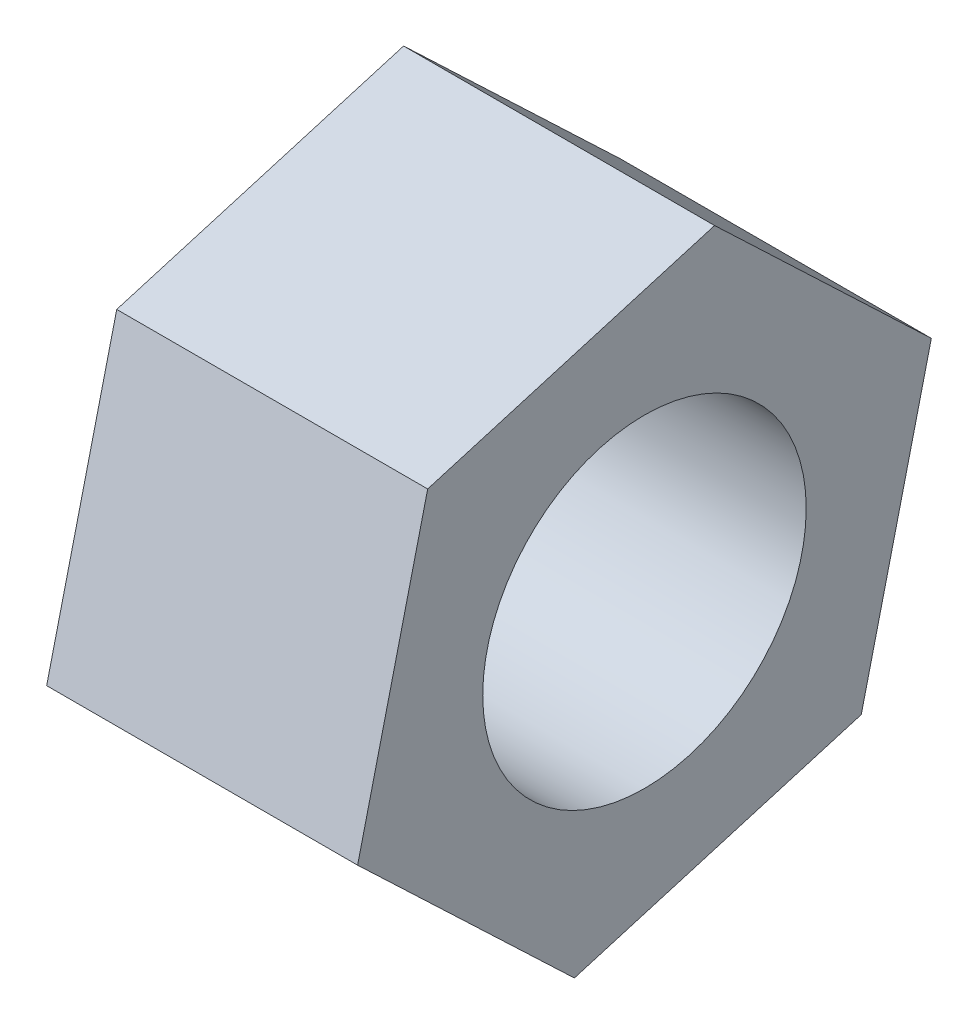
ISO-10303-21;
HEADER;
FILE_DESCRIPTION(('STEP AP214'),'2;1');
FILE_NAME('part.step','',(''),(''),'','','');
FILE_SCHEMA(('AUTOMOTIVE_DESIGN { 1 0 10303 214 1 1 1 1 }'));
ENDSEC;
DATA;
#1=APPLICATION_CONTEXT('core data for automotive mechanical design processes');
#2=APPLICATION_PROTOCOL_DEFINITION('international standard','automotive_design',2000,#1);
#3=PRODUCT_CONTEXT('',#1,'mechanical');
#4=PRODUCT('Part','Part','',(#3));
#5=PRODUCT_RELATED_PRODUCT_CATEGORY('part','',(#4));
#6=PRODUCT_DEFINITION_FORMATION('','',#4);
#7=PRODUCT_DEFINITION_CONTEXT('part definition',#1,'design');
#8=PRODUCT_DEFINITION('design','',#6,#7);
#9=PRODUCT_DEFINITION_SHAPE('','',#8);
#10=(LENGTH_UNIT() NAMED_UNIT(*) SI_UNIT(.MILLI.,.METRE.));
#11=(NAMED_UNIT(*) PLANE_ANGLE_UNIT() SI_UNIT($,.RADIAN.));
#12=(NAMED_UNIT(*) SI_UNIT($,.STERADIAN.) SOLID_ANGLE_UNIT());
#13=UNCERTAINTY_MEASURE_WITH_UNIT(LENGTH_MEASURE(1.E-05),#10,'distance_accuracy_value','');
#14=(GEOMETRIC_REPRESENTATION_CONTEXT(3) GLOBAL_UNCERTAINTY_ASSIGNED_CONTEXT((#13)) GLOBAL_UNIT_ASSIGNED_CONTEXT((#10,
#11,#12)) REPRESENTATION_CONTEXT('',''));
#15=CARTESIAN_POINT('',(0.,0.,0.));
#16=DIRECTION('',(0.,0.,1.));
#17=DIRECTION('',(1.,0.,0.));
#18=AXIS2_PLACEMENT_3D('',#15,#16,#17);
#19=CARTESIAN_POINT('',(5.96,-5.57350573781124,1.34325492390135));
#20=DIRECTION('',(0.,0.959068629866461,0.283173733255875));
#21=DIRECTION('',(0.,-0.283173733255875,0.959068629866461));
#22=AXIS2_PLACEMENT_3D('',#19,#20,#21);
#23=PLANE('',#22);
#24=DIRECTION('',(0.,0.283173733255875,-0.959068629866461));
#25=VECTOR('',#24,1.);
#26=CARTESIAN_POINT('',(0.,-5.57350573781124,1.34325492390135));
#27=LINE('',#26,#25);
#28=CARTESIAN_POINT('',(0.,-5.57350573781124,1.34325492390135));
#29=VERTEX_POINT('',#28);
#30=CARTESIAN_POINT('',(0.,-3.95004575676272,-4.15517009513219));
#31=VERTEX_POINT('',#30);
#32=EDGE_CURVE('E123',#29,#31,#27,.T.);
#33=ORIENTED_EDGE('',*,*,#32,.T.);
#34=DIRECTION('',(-1.,0.,0.));
#35=VECTOR('',#34,1.);
#36=CARTESIAN_POINT('',(5.96,-3.95004575676272,-4.15517009513219));
#37=LINE('',#36,#35);
#38=CARTESIAN_POINT('',(5.96,-3.95004575676272,-4.15517009513219));
#39=VERTEX_POINT('',#38);
#40=EDGE_CURVE('E11',#39,#31,#37,.T.);
#41=ORIENTED_EDGE('',*,*,#40,.F.);
#42=DIRECTION('',(0.,0.283173733255875,-0.959068629866461));
#43=VECTOR('',#42,1.);
#44=CARTESIAN_POINT('',(5.96,-5.57350573781124,1.34325492390135));
#45=LINE('',#44,#43);
#46=CARTESIAN_POINT('',(5.96,-5.57350573781124,1.34325492390135));
#47=VERTEX_POINT('',#46);
#48=EDGE_CURVE('E134',#47,#39,#45,.T.);
#49=ORIENTED_EDGE('',*,*,#48,.F.);
#50=DIRECTION('',(-1.,0.,0.));
#51=VECTOR('',#50,1.);
#52=CARTESIAN_POINT('',(5.96,-5.57350573781124,1.34325492390135));
#53=LINE('',#52,#51);
#54=EDGE_CURVE('E119',#47,#29,#53,.T.);
#55=ORIENTED_EDGE('',*,*,#54,.T.);
#56=EDGE_LOOP('',(#33,#41,#49,#55));
#57=FACE_BOUND('',#56,.T.);
#58=ADVANCED_FACE('F39',(#57),#23,.F.);
#59=CARTESIAN_POINT('',(5.96,-3.95004575676272,-4.15517009513219));
#60=DIRECTION('',(0.,0.234298668249164,0.972164664065028));
#61=DIRECTION('',(0.,-0.972164664065028,0.234298668249164));
#62=AXIS2_PLACEMENT_3D('',#59,#60,#61);
#63=PLANE('',#62);
#64=DIRECTION('',(0.,0.972164664065028,-0.234298668249164));
#65=VECTOR('',#64,1.);
#66=CARTESIAN_POINT('',(0.,-3.95004575676272,-4.15517009513219));
#67=LINE('',#66,#65);
#68=CARTESIAN_POINT('',(0.,1.62345998104851,-5.49842501903354));
#69=VERTEX_POINT('',#68);
#70=EDGE_CURVE('E126',#31,#69,#67,.T.);
#71=ORIENTED_EDGE('',*,*,#70,.T.);
#72=DIRECTION('',(-1.,0.,0.));
#73=VECTOR('',#72,1.);
#74=CARTESIAN_POINT('',(5.96,1.62345998104851,-5.49842501903354));
#75=LINE('',#74,#73);
#76=CARTESIAN_POINT('',(5.96,1.62345998104851,-5.49842501903354));
#77=VERTEX_POINT('',#76);
#78=EDGE_CURVE('E47',#77,#69,#75,.T.);
#79=ORIENTED_EDGE('',*,*,#78,.F.);
#80=DIRECTION('',(0.,0.972164664065028,-0.234298668249164));
#81=VECTOR('',#80,1.);
#82=CARTESIAN_POINT('',(5.96,-3.95004575676272,-4.15517009513219));
#83=LINE('',#82,#81);
#84=EDGE_CURVE('E92',#39,#77,#83,.T.);
#85=ORIENTED_EDGE('',*,*,#84,.F.);
#86=ORIENTED_EDGE('',*,*,#40,.T.);
#87=EDGE_LOOP('',(#71,#79,#85,#86));
#88=FACE_BOUND('',#87,.T.);
#89=ADVANCED_FACE('F159',(#88),#63,.F.);
#90=CARTESIAN_POINT('',(5.96,1.62345998104851,-5.49842501903354));
#91=DIRECTION('',(0.,-0.724769961617296,0.688990930809154));
#92=DIRECTION('',(0.,-0.688990930809154,-0.724769961617296));
#93=AXIS2_PLACEMENT_3D('',#90,#91,#92);
#94=PLANE('',#93);
#95=DIRECTION('',(0.,0.688990930809154,0.724769961617296));
#96=VECTOR('',#95,1.);
#97=CARTESIAN_POINT('',(0.,1.62345998104851,-5.49842501903354));
#98=LINE('',#97,#96);
#99=CARTESIAN_POINT('',(0.,5.57350573781124,-1.34325492390135));
#100=VERTEX_POINT('',#99);
#101=EDGE_CURVE('E129',#69,#100,#98,.T.);
#102=ORIENTED_EDGE('',*,*,#101,.T.);
#103=DIRECTION('',(-1.,0.,0.));
#104=VECTOR('',#103,1.);
#105=CARTESIAN_POINT('',(5.96,5.57350573781124,-1.34325492390135));
#106=LINE('',#105,#104);
#107=CARTESIAN_POINT('',(5.96,5.57350573781124,-1.34325492390135));
#108=VERTEX_POINT('',#107);
#109=EDGE_CURVE('E114',#108,#100,#106,.T.);
#110=ORIENTED_EDGE('',*,*,#109,.F.);
#111=DIRECTION('',(0.,0.688990930809154,0.724769961617296));
#112=VECTOR('',#111,1.);
#113=CARTESIAN_POINT('',(5.96,1.62345998104851,-5.49842501903354));
#114=LINE('',#113,#112);
#115=EDGE_CURVE('E105',#77,#108,#114,.T.);
#116=ORIENTED_EDGE('',*,*,#115,.F.);
#117=ORIENTED_EDGE('',*,*,#78,.T.);
#118=EDGE_LOOP('',(#102,#110,#116,#117));
#119=FACE_BOUND('',#118,.T.);
#120=ADVANCED_FACE('F140',(#119),#94,.F.);
#121=CARTESIAN_POINT('',(5.96,5.57350573781124,-1.34325492390135));
#122=DIRECTION('',(0.,-0.959068629866461,-0.283173733255876));
#123=DIRECTION('',(0.,0.283173733255876,-0.959068629866461));
#124=AXIS2_PLACEMENT_3D('',#121,#122,#123);
#125=PLANE('',#124);
#126=DIRECTION('',(0.,-0.283173733255876,0.959068629866461));
#127=VECTOR('',#126,1.);
#128=CARTESIAN_POINT('',(0.,5.57350573781124,-1.34325492390135));
#129=LINE('',#128,#127);
#130=CARTESIAN_POINT('',(0.,3.95004575676272,4.15517009513219));
#131=VERTEX_POINT('',#130);
#132=EDGE_CURVE('E113',#100,#131,#129,.T.);
#133=ORIENTED_EDGE('',*,*,#132,.T.);
#134=DIRECTION('',(-1.,0.,0.));
#135=VECTOR('',#134,1.);
#136=CARTESIAN_POINT('',(5.96,3.95004575676272,4.15517009513219));
#137=LINE('',#136,#135);
#138=CARTESIAN_POINT('',(5.96,3.95004575676272,4.15517009513219));
#139=VERTEX_POINT('',#138);
#140=EDGE_CURVE('E110',#139,#131,#137,.T.);
#141=ORIENTED_EDGE('',*,*,#140,.F.);
#142=DIRECTION('',(0.,-0.283173733255876,0.959068629866461));
#143=VECTOR('',#142,1.);
#144=CARTESIAN_POINT('',(5.96,5.57350573781124,-1.34325492390135));
#145=LINE('',#144,#143);
#146=EDGE_CURVE('E99',#108,#139,#145,.T.);
#147=ORIENTED_EDGE('',*,*,#146,.F.);
#148=ORIENTED_EDGE('',*,*,#109,.T.);
#149=EDGE_LOOP('',(#133,#141,#147,#148));
#150=FACE_BOUND('',#149,.T.);
#151=ADVANCED_FACE('F111',(#150),#125,.F.);
#152=CARTESIAN_POINT('',(5.96,3.95004575676272,4.15517009513219));
#153=DIRECTION('',(0.,-0.234298668249165,-0.972164664065028));
#154=DIRECTION('',(0.,0.972164664065028,-0.234298668249165));
#155=AXIS2_PLACEMENT_3D('',#152,#153,#154);
#156=PLANE('',#155);
#157=DIRECTION('',(0.,-0.972164664065028,0.234298668249165));
#158=VECTOR('',#157,1.);
#159=CARTESIAN_POINT('',(0.,3.95004575676272,4.15517009513219));
#160=LINE('',#159,#158);
#161=CARTESIAN_POINT('',(0.,-1.62345998104852,5.49842501903354));
#162=VERTEX_POINT('',#161);
#163=EDGE_CURVE('E78',#131,#162,#160,.T.);
#164=ORIENTED_EDGE('',*,*,#163,.T.);
#165=DIRECTION('',(-1.,0.,0.));
#166=VECTOR('',#165,1.);
#167=CARTESIAN_POINT('',(5.96,-1.62345998104852,5.49842501903354));
#168=LINE('',#167,#166);
#169=CARTESIAN_POINT('',(5.96,-1.62345998104852,5.49842501903354));
#170=VERTEX_POINT('',#169);
#171=EDGE_CURVE('E115',#170,#162,#168,.T.);
#172=ORIENTED_EDGE('',*,*,#171,.F.);
#173=DIRECTION('',(0.,-0.972164664065028,0.234298668249165));
#174=VECTOR('',#173,1.);
#175=CARTESIAN_POINT('',(5.96,3.95004575676272,4.15517009513219));
#176=LINE('',#175,#174);
#177=EDGE_CURVE('E103',#139,#170,#176,.T.);
#178=ORIENTED_EDGE('',*,*,#177,.F.);
#179=ORIENTED_EDGE('',*,*,#140,.T.);
#180=EDGE_LOOP('',(#164,#172,#178,#179));
#181=FACE_BOUND('',#180,.T.);
#182=ADVANCED_FACE('F117',(#181),#156,.F.);
#183=CARTESIAN_POINT('',(5.96,-1.62345998104852,5.49842501903354));
#184=DIRECTION('',(0.,0.724769961617296,-0.688990930809153));
#185=DIRECTION('',(0.,0.688990930809153,0.724769961617296));
#186=AXIS2_PLACEMENT_3D('',#183,#184,#185);
#187=PLANE('',#186);
#188=DIRECTION('',(0.,-0.688990930809153,-0.724769961617296));
#189=VECTOR('',#188,1.);
#190=CARTESIAN_POINT('',(0.,-1.62345998104852,5.49842501903354));
#191=LINE('',#190,#189);
#192=EDGE_CURVE('E84',#162,#29,#191,.T.);
#193=ORIENTED_EDGE('',*,*,#192,.T.);
#194=ORIENTED_EDGE('',*,*,#54,.F.);
#195=DIRECTION('',(0.,-0.688990930809153,-0.724769961617296));
#196=VECTOR('',#195,1.);
#197=CARTESIAN_POINT('',(5.96,-1.62345998104852,5.49842501903354));
#198=LINE('',#197,#196);
#199=EDGE_CURVE('E55',#170,#47,#198,.T.);
#200=ORIENTED_EDGE('',*,*,#199,.F.);
#201=ORIENTED_EDGE('',*,*,#171,.T.);
#202=EDGE_LOOP('',(#193,#194,#200,#201));
#203=FACE_BOUND('',#202,.T.);
#204=ADVANCED_FACE('F147',(#203),#187,.F.);
#205=CARTESIAN_POINT('',(5.96,0.,0.));
#206=DIRECTION('',(1.,0.,0.));
#207=DIRECTION('',(0.,0.,-1.));
#208=AXIS2_PLACEMENT_3D('',#205,#206,#207);
#209=PLANE('',#208);
#210=CARTESIAN_POINT('',(5.96,0.,0.));
#211=DIRECTION('',(1.,0.,0.));
#212=DIRECTION('',(0.,0.,-1.));
#213=AXIS2_PLACEMENT_3D('',#210,#211,#212);
#214=CIRCLE('',#213,3.1);
#215=CARTESIAN_POINT('',(5.96,0.,-3.1));
#216=VERTEX_POINT('',#215);
#217=EDGE_CURVE('E215',#216,#216,#214,.T.);
#218=ORIENTED_EDGE('',*,*,#217,.F.);
#219=EDGE_LOOP('',(#218));
#220=FACE_BOUND('',#219,.T.);
#221=ORIENTED_EDGE('',*,*,#48,.T.);
#222=ORIENTED_EDGE('',*,*,#84,.T.);
#223=ORIENTED_EDGE('',*,*,#115,.T.);
#224=ORIENTED_EDGE('',*,*,#146,.T.);
#225=ORIENTED_EDGE('',*,*,#177,.T.);
#226=ORIENTED_EDGE('',*,*,#199,.T.);
#227=EDGE_LOOP('',(#221,#222,#223,#224,#225,#226));
#228=FACE_BOUND('',#227,.T.);
#229=ADVANCED_FACE('F101',(#220,#228),#209,.T.);
#230=CARTESIAN_POINT('',(0.,0.,0.));
#231=DIRECTION('',(1.,0.,0.));
#232=DIRECTION('',(0.,0.,-1.));
#233=AXIS2_PLACEMENT_3D('',#230,#231,#232);
#234=PLANE('',#233);
#235=CARTESIAN_POINT('',(0.,0.,0.));
#236=DIRECTION('',(1.,0.,0.));
#237=DIRECTION('',(0.,0.,-1.));
#238=AXIS2_PLACEMENT_3D('',#235,#236,#237);
#239=CIRCLE('',#238,3.1);
#240=CARTESIAN_POINT('',(0.,0.,-3.1));
#241=VERTEX_POINT('',#240);
#242=EDGE_CURVE('E127',#241,#241,#239,.T.);
#243=ORIENTED_EDGE('',*,*,#242,.T.);
#244=EDGE_LOOP('',(#243));
#245=FACE_BOUND('',#244,.T.);
#246=ORIENTED_EDGE('',*,*,#32,.F.);
#247=ORIENTED_EDGE('',*,*,#192,.F.);
#248=ORIENTED_EDGE('',*,*,#163,.F.);
#249=ORIENTED_EDGE('',*,*,#132,.F.);
#250=ORIENTED_EDGE('',*,*,#101,.F.);
#251=ORIENTED_EDGE('',*,*,#70,.F.);
#252=EDGE_LOOP('',(#246,#247,#248,#249,#250,#251));
#253=FACE_BOUND('',#252,.T.);
#254=ADVANCED_FACE('F143',(#245,#253),#234,.F.);
#255=CARTESIAN_POINT('',(0.,0.,0.));
#256=DIRECTION('',(1.,0.,0.));
#257=DIRECTION('',(0.,0.,-1.));
#258=AXIS2_PLACEMENT_3D('',#255,#256,#257);
#259=CYLINDRICAL_SURFACE('',#258,3.1);
#260=ORIENTED_EDGE('',*,*,#242,.F.);
#261=EDGE_LOOP('',(#260));
#262=FACE_BOUND('',#261,.T.);
#263=ORIENTED_EDGE('',*,*,#217,.T.);
#264=EDGE_LOOP('',(#263));
#265=FACE_BOUND('',#264,.T.);
#266=ADVANCED_FACE('F198',(#262,#265),#259,.F.);
#267=CLOSED_SHELL('',(#58,#89,#120,#151,#182,#204,#229,#254,#266));
#268=MANIFOLD_SOLID_BREP('B2',#267);
#269=ADVANCED_BREP_SHAPE_REPRESENTATION('',(#18,#268),#14);
#270=SHAPE_DEFINITION_REPRESENTATION(#9,#269);
ENDSEC;
END-ISO-10303-21;
